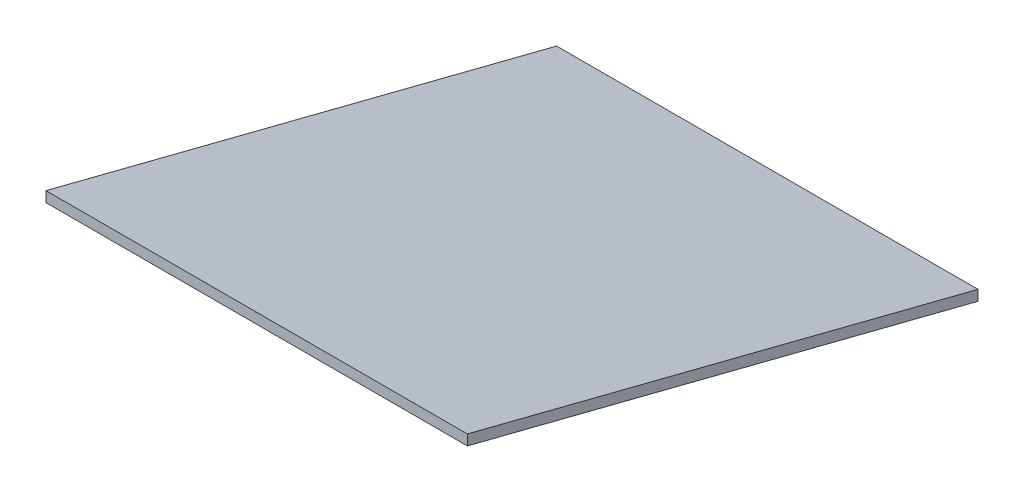
ISO-10303-21;
HEADER;
FILE_DESCRIPTION(('STEP AP214'),'2;1');
FILE_NAME('part.step','',(''),(''),'','','');
FILE_SCHEMA(('AUTOMOTIVE_DESIGN { 1 0 10303 214 1 1 1 1 }'));
ENDSEC;
DATA;
#1=APPLICATION_CONTEXT('core data for automotive mechanical design processes');
#2=APPLICATION_PROTOCOL_DEFINITION('international standard','automotive_design',2000,#1);
#3=PRODUCT_CONTEXT('',#1,'mechanical');
#4=PRODUCT('Part','Part','',(#3));
#5=PRODUCT_RELATED_PRODUCT_CATEGORY('part','',(#4));
#6=PRODUCT_DEFINITION_FORMATION('','',#4);
#7=PRODUCT_DEFINITION_CONTEXT('part definition',#1,'design');
#8=PRODUCT_DEFINITION('design','',#6,#7);
#9=PRODUCT_DEFINITION_SHAPE('','',#8);
#10=(LENGTH_UNIT() NAMED_UNIT(*) SI_UNIT(.MILLI.,.METRE.));
#11=(NAMED_UNIT(*) PLANE_ANGLE_UNIT() SI_UNIT($,.RADIAN.));
#12=(NAMED_UNIT(*) SI_UNIT($,.STERADIAN.) SOLID_ANGLE_UNIT());
#13=UNCERTAINTY_MEASURE_WITH_UNIT(LENGTH_MEASURE(1.E-05),#10,'distance_accuracy_value','');
#14=(GEOMETRIC_REPRESENTATION_CONTEXT(3) GLOBAL_UNCERTAINTY_ASSIGNED_CONTEXT((#13)) GLOBAL_UNIT_ASSIGNED_CONTEXT((#10,
#11,#12)) REPRESENTATION_CONTEXT('',''));
#15=CARTESIAN_POINT('',(0.,0.,0.));
#16=DIRECTION('',(0.,0.,1.));
#17=DIRECTION('',(1.,0.,0.));
#18=AXIS2_PLACEMENT_3D('',#15,#16,#17);
#19=CARTESIAN_POINT('',(0.,0.,508.));
#20=DIRECTION('',(0.,0.,-1.));
#21=DIRECTION('',(-1.,0.,0.));
#22=AXIS2_PLACEMENT_3D('',#19,#20,#21);
#23=PLANE('',#22);
#24=DIRECTION('',(0.,1.,0.));
#25=VECTOR('',#24,1.);
#26=CARTESIAN_POINT('',(-879.092307014223,-341.80784495359,508.));
#27=LINE('',#26,#25);
#28=CARTESIAN_POINT('',(-879.092307014223,-341.80784495359,508.));
#29=VERTEX_POINT('',#28);
#30=CARTESIAN_POINT('',(-879.092307014223,-331.64784495359,508.));
#31=VERTEX_POINT('',#30);
#32=EDGE_CURVE('E104',#29,#31,#27,.T.);
#33=ORIENTED_EDGE('',*,*,#32,.F.);
#34=DIRECTION('',(-1.,0.,0.));
#35=VECTOR('',#34,1.);
#36=CARTESIAN_POINT('',(-467.661709408196,-341.80784495359,508.));
#37=LINE('',#36,#35);
#38=CARTESIAN_POINT('',(-467.661709408196,-341.80784495359,508.));
#39=VERTEX_POINT('',#38);
#40=EDGE_CURVE('E13',#39,#29,#37,.T.);
#41=ORIENTED_EDGE('',*,*,#40,.F.);
#42=DIRECTION('',(0.,-1.,0.));
#43=VECTOR('',#42,1.);
#44=CARTESIAN_POINT('',(-467.661709408196,-331.64784495359,508.));
#45=LINE('',#44,#43);
#46=CARTESIAN_POINT('',(-467.661709408196,-331.64784495359,508.));
#47=VERTEX_POINT('',#46);
#48=EDGE_CURVE('E64',#47,#39,#45,.T.);
#49=ORIENTED_EDGE('',*,*,#48,.F.);
#50=DIRECTION('',(1.,0.,0.));
#51=VECTOR('',#50,1.);
#52=CARTESIAN_POINT('',(-879.092307014223,-331.64784495359,508.));
#53=LINE('',#52,#51);
#54=EDGE_CURVE('E251',#31,#47,#53,.T.);
#55=ORIENTED_EDGE('',*,*,#54,.F.);
#56=EDGE_LOOP('',(#33,#41,#49,#55));
#57=FACE_BOUND('',#56,.T.);
#58=ADVANCED_FACE('F54',(#57),#23,.F.);
#59=CARTESIAN_POINT('',(0.,0.,9.40841954528571));
#60=DIRECTION('',(0.,0.,1.));
#61=DIRECTION('',(1.,0.,0.));
#62=AXIS2_PLACEMENT_3D('',#59,#60,#61);
#63=PLANE('',#62);
#64=DIRECTION('',(0.,-1.,0.));
#65=VECTOR('',#64,1.);
#66=CARTESIAN_POINT('',(-879.092307014223,-458.64784495359,9.40841954528571));
#67=LINE('',#66,#65);
#68=CARTESIAN_POINT('',(-879.092307014223,-458.64784495359,9.40841954528571));
#69=VERTEX_POINT('',#68);
#70=CARTESIAN_POINT('',(-879.092307014223,-468.80784495359,9.40841954528571));
#71=VERTEX_POINT('',#70);
#72=EDGE_CURVE('E102',#69,#71,#67,.T.);
#73=ORIENTED_EDGE('',*,*,#72,.F.);
#74=DIRECTION('',(-1.,0.,0.));
#75=VECTOR('',#74,1.);
#76=CARTESIAN_POINT('',(-879.092307014223,-458.64784495359,9.40841954528571));
#77=LINE('',#76,#75);
#78=CARTESIAN_POINT('',(-467.661709408196,-458.64784495359,9.40841954528571));
#79=VERTEX_POINT('',#78);
#80=EDGE_CURVE('E109',#79,#69,#77,.T.);
#81=ORIENTED_EDGE('',*,*,#80,.F.);
#82=DIRECTION('',(0.,1.,0.));
#83=VECTOR('',#82,1.);
#84=CARTESIAN_POINT('',(-467.661709408196,-458.64784495359,9.40841954528571));
#85=LINE('',#84,#83);
#86=CARTESIAN_POINT('',(-467.661709408196,-468.80784495359,9.40841954528571));
#87=VERTEX_POINT('',#86);
#88=EDGE_CURVE('E121',#87,#79,#85,.T.);
#89=ORIENTED_EDGE('',*,*,#88,.F.);
#90=DIRECTION('',(1.,0.,0.));
#91=VECTOR('',#90,1.);
#92=CARTESIAN_POINT('',(-879.092307014223,-468.80784495359,9.40841954528571));
#93=LINE('',#92,#91);
#94=EDGE_CURVE('E127',#71,#87,#93,.T.);
#95=ORIENTED_EDGE('',*,*,#94,.F.);
#96=EDGE_LOOP('',(#73,#81,#89,#95));
#97=FACE_BOUND('',#96,.T.);
#98=ADVANCED_FACE('F125',(#97),#63,.F.);
#99=CARTESIAN_POINT('',(-467.661709408196,-468.80784495359,9.40841954528571));
#100=DIRECTION('',(1.,0.,0.));
#101=DIRECTION('',(0.,1.,0.));
#102=AXIS2_PLACEMENT_3D('',#99,#100,#101);
#103=PLANE('',#102);
#104=ORIENTED_EDGE('',*,*,#88,.T.);
#105=CARTESIAN_POINT('',(-467.661709408196,-458.64784495359,9.40841954528557));
#106=DIRECTION('',(0.,0.246835852548013,0.969057305785832));
#107=VECTOR('',#106,1.);
#108=LINE('',#105,#107);
#109=EDGE_CURVE('E116',#79,#47,#108,.T.);
#110=ORIENTED_EDGE('',*,*,#109,.T.);
#111=ORIENTED_EDGE('',*,*,#48,.T.);
#112=DIRECTION('',(0.,0.246835852548013,0.969057305785832));
#113=VECTOR('',#112,1.);
#114=CARTESIAN_POINT('',(-467.661709408196,-405.30784495359,258.704209772643));
#115=LINE('',#114,#113);
#116=EDGE_CURVE('E205',#87,#39,#115,.T.);
#117=ORIENTED_EDGE('',*,*,#116,.F.);
#118=EDGE_LOOP('',(#104,#110,#111,#117));
#119=FACE_BOUND('',#118,.T.);
#120=ADVANCED_FACE('F148',(#119),#103,.T.);
#121=CARTESIAN_POINT('',(-879.092307014223,-468.80784495359,9.4084195452857));
#122=DIRECTION('',(0.,-0.969057305785832,0.246835852548013));
#123=DIRECTION('',(1.,0.,0.));
#124=AXIS2_PLACEMENT_3D('',#121,#122,#123);
#125=PLANE('',#124);
#126=ORIENTED_EDGE('',*,*,#94,.T.);
#127=ORIENTED_EDGE('',*,*,#116,.T.);
#128=ORIENTED_EDGE('',*,*,#40,.T.);
#129=DIRECTION('',(0.,0.246835852548013,0.969057305785832));
#130=VECTOR('',#129,1.);
#131=CARTESIAN_POINT('',(-879.092307014223,-405.30784495359,258.704209772643));
#132=LINE('',#131,#130);
#133=EDGE_CURVE('E72',#71,#29,#132,.T.);
#134=ORIENTED_EDGE('',*,*,#133,.F.);
#135=EDGE_LOOP('',(#126,#127,#128,#134));
#136=FACE_BOUND('',#135,.T.);
#137=ADVANCED_FACE('F188',(#136),#125,.T.);
#138=CARTESIAN_POINT('',(-879.092307014223,-458.64784495359,9.40841954528571));
#139=DIRECTION('',(-1.,0.,0.));
#140=DIRECTION('',(0.,-1.,0.));
#141=AXIS2_PLACEMENT_3D('',#138,#139,#140);
#142=PLANE('',#141);
#143=ORIENTED_EDGE('',*,*,#72,.T.);
#144=ORIENTED_EDGE('',*,*,#133,.T.);
#145=ORIENTED_EDGE('',*,*,#32,.T.);
#146=CARTESIAN_POINT('',(-879.092307014223,-458.64784495359,9.40841954528569));
#147=DIRECTION('',(0.,0.246835852548013,0.969057305785832));
#148=VECTOR('',#147,1.);
#149=LINE('',#146,#148);
#150=EDGE_CURVE('E97',#69,#31,#149,.T.);
#151=ORIENTED_EDGE('',*,*,#150,.F.);
#152=EDGE_LOOP('',(#143,#144,#145,#151));
#153=FACE_BOUND('',#152,.T.);
#154=ADVANCED_FACE('F100',(#153),#142,.T.);
#155=CARTESIAN_POINT('',(0.,-432.953853394925,110.280922375402));
#156=DIRECTION('',(0.,0.969057305785832,-0.246835852548013));
#157=DIRECTION('',(0.,0.246835852548013,0.969057305785832));
#158=AXIS2_PLACEMENT_3D('',#155,#156,#157);
#159=PLANE('',#158);
#160=ORIENTED_EDGE('',*,*,#150,.T.);
#161=ORIENTED_EDGE('',*,*,#54,.T.);
#162=ORIENTED_EDGE('',*,*,#109,.F.);
#163=ORIENTED_EDGE('',*,*,#80,.T.);
#164=EDGE_LOOP('',(#160,#161,#162,#163));
#165=FACE_BOUND('',#164,.T.);
#166=ADVANCED_FACE('F114',(#165),#159,.T.);
#167=CLOSED_SHELL('',(#58,#98,#120,#137,#154,#166));
#168=MANIFOLD_SOLID_BREP('B2',#167);
#169=ADVANCED_BREP_SHAPE_REPRESENTATION('',(#18,#168),#14);
#170=SHAPE_DEFINITION_REPRESENTATION(#9,#169);
ENDSEC;
END-ISO-10303-21;
